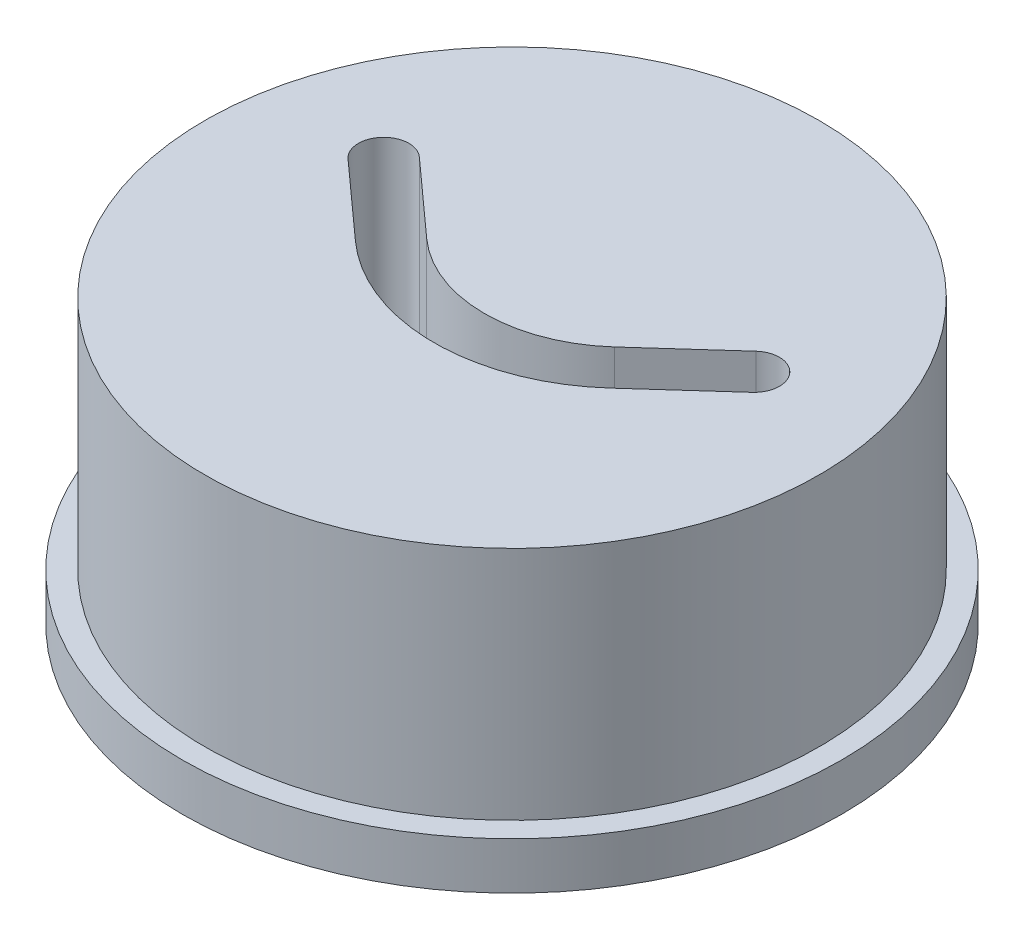
ISO-10303-21;
HEADER;
FILE_DESCRIPTION(('STEP AP214'),'2;1');
FILE_NAME('part.step','',(''),(''),'','','');
FILE_SCHEMA(('AUTOMOTIVE_DESIGN { 1 0 10303 214 1 1 1 1 }'));
ENDSEC;
DATA;
#1=APPLICATION_CONTEXT('core data for automotive mechanical design processes');
#2=APPLICATION_PROTOCOL_DEFINITION('international standard','automotive_design',2000,#1);
#3=PRODUCT_CONTEXT('',#1,'mechanical');
#4=PRODUCT('Part','Part','',(#3));
#5=PRODUCT_RELATED_PRODUCT_CATEGORY('part','',(#4));
#6=PRODUCT_DEFINITION_FORMATION('','',#4);
#7=PRODUCT_DEFINITION_CONTEXT('part definition',#1,'design');
#8=PRODUCT_DEFINITION('design','',#6,#7);
#9=PRODUCT_DEFINITION_SHAPE('','',#8);
#10=(LENGTH_UNIT() NAMED_UNIT(*) SI_UNIT(.MILLI.,.METRE.));
#11=(NAMED_UNIT(*) PLANE_ANGLE_UNIT() SI_UNIT($,.RADIAN.));
#12=(NAMED_UNIT(*) SI_UNIT($,.STERADIAN.) SOLID_ANGLE_UNIT());
#13=UNCERTAINTY_MEASURE_WITH_UNIT(LENGTH_MEASURE(1.E-05),#10,'distance_accuracy_value','');
#14=(GEOMETRIC_REPRESENTATION_CONTEXT(3) GLOBAL_UNCERTAINTY_ASSIGNED_CONTEXT((#13)) GLOBAL_UNIT_ASSIGNED_CONTEXT((#10,
#11,#12)) REPRESENTATION_CONTEXT('',''));
#15=CARTESIAN_POINT('',(0.,0.,0.));
#16=DIRECTION('',(0.,0.,1.));
#17=DIRECTION('',(1.,0.,0.));
#18=AXIS2_PLACEMENT_3D('',#15,#16,#17);
#19=CARTESIAN_POINT('',(0.,19.05,0.));
#20=DIRECTION('',(0.,-1.,0.));
#21=DIRECTION('',(0.,0.,-1.));
#22=AXIS2_PLACEMENT_3D('',#19,#20,#21);
#23=CYLINDRICAL_SURFACE('',#22,20.701);
#24=CARTESIAN_POINT('',(0.,19.05,0.));
#25=DIRECTION('',(0.,1.,0.));
#26=DIRECTION('',(0.,0.,1.));
#27=AXIS2_PLACEMENT_3D('',#24,#25,#26);
#28=CIRCLE('',#27,20.701);
#29=CARTESIAN_POINT('',(0.,19.05,-20.701));
#30=VERTEX_POINT('',#29);
#31=EDGE_CURVE('E282',#30,#30,#28,.T.);
#32=CARTESIAN_POINT('',(0.,3.175,0.));
#33=DIRECTION('',(0.,-1.,0.));
#34=DIRECTION('',(0.,0.,-1.));
#35=AXIS2_PLACEMENT_3D('',#32,#33,#34);
#36=CIRCLE('',#35,20.701);
#37=CARTESIAN_POINT('',(0.,3.175,-20.701));
#38=VERTEX_POINT('',#37);
#39=EDGE_CURVE('E11',#38,#38,#36,.T.);
#40=CARTESIAN_POINT('',(0.,19.05,-20.701));
#41=CARTESIAN_POINT('',(0.,18.8846354166667,-20.701));
#42=CARTESIAN_POINT('',(0.,18.7192708333333,-20.701));
#43=CARTESIAN_POINT('',(0.,18.3885416666667,-20.701));
#44=CARTESIAN_POINT('',(0.,18.2231770833333,-20.701));
#45=CARTESIAN_POINT('',(0.,17.8924479166667,-20.701));
#46=CARTESIAN_POINT('',(0.,17.7270833333333,-20.701));
#47=CARTESIAN_POINT('',(0.,17.3963541666667,-20.701));
#48=CARTESIAN_POINT('',(0.,17.2309895833333,-20.701));
#49=CARTESIAN_POINT('',(0.,16.9002604166667,-20.701));
#50=CARTESIAN_POINT('',(0.,16.7348958333333,-20.701));
#51=CARTESIAN_POINT('',(0.,16.4041666666667,-20.701));
#52=CARTESIAN_POINT('',(0.,16.2388020833333,-20.701));
#53=CARTESIAN_POINT('',(0.,15.9080729166667,-20.701));
#54=CARTESIAN_POINT('',(0.,15.7427083333333,-20.701));
#55=CARTESIAN_POINT('',(0.,15.4119791666667,-20.701));
#56=CARTESIAN_POINT('',(0.,15.2466145833333,-20.701));
#57=CARTESIAN_POINT('',(0.,14.9158854166667,-20.701));
#58=CARTESIAN_POINT('',(0.,14.7505208333333,-20.701));
#59=CARTESIAN_POINT('',(0.,14.4197916666667,-20.701));
#60=CARTESIAN_POINT('',(0.,14.2544270833333,-20.701));
#61=CARTESIAN_POINT('',(0.,13.9236979166667,-20.701));
#62=CARTESIAN_POINT('',(0.,13.7583333333333,-20.701));
#63=CARTESIAN_POINT('',(0.,13.4276041666667,-20.701));
#64=CARTESIAN_POINT('',(0.,13.2622395833333,-20.701));
#65=CARTESIAN_POINT('',(0.,12.9315104166667,-20.701));
#66=CARTESIAN_POINT('',(0.,12.7661458333333,-20.701));
#67=CARTESIAN_POINT('',(0.,12.4354166666667,-20.701));
#68=CARTESIAN_POINT('',(0.,12.2700520833333,-20.701));
#69=CARTESIAN_POINT('',(0.,11.9393229166667,-20.701));
#70=CARTESIAN_POINT('',(0.,11.7739583333333,-20.701));
#71=CARTESIAN_POINT('',(0.,11.4432291666667,-20.701));
#72=CARTESIAN_POINT('',(0.,11.2778645833333,-20.701));
#73=CARTESIAN_POINT('',(0.,10.9471354166667,-20.701));
#74=CARTESIAN_POINT('',(0.,10.7817708333333,-20.701));
#75=CARTESIAN_POINT('',(0.,10.4510416666667,-20.701));
#76=CARTESIAN_POINT('',(0.,10.2856770833333,-20.701));
#77=CARTESIAN_POINT('',(0.,9.95494791666667,-20.701));
#78=CARTESIAN_POINT('',(0.,9.78958333333334,-20.701));
#79=CARTESIAN_POINT('',(0.,9.45885416666667,-20.701));
#80=CARTESIAN_POINT('',(0.,9.29348958333334,-20.701));
#81=CARTESIAN_POINT('',(0.,8.96276041666667,-20.701));
#82=CARTESIAN_POINT('',(0.,8.79739583333334,-20.701));
#83=CARTESIAN_POINT('',(0.,8.46666666666667,-20.701));
#84=CARTESIAN_POINT('',(0.,8.30130208333334,-20.701));
#85=CARTESIAN_POINT('',(0.,7.97057291666667,-20.701));
#86=CARTESIAN_POINT('',(0.,7.80520833333334,-20.701));
#87=CARTESIAN_POINT('',(0.,7.47447916666667,-20.701));
#88=CARTESIAN_POINT('',(0.,7.30911458333334,-20.701));
#89=CARTESIAN_POINT('',(0.,6.97838541666667,-20.701));
#90=CARTESIAN_POINT('',(0.,6.81302083333334,-20.701));
#91=CARTESIAN_POINT('',(0.,6.48229166666667,-20.701));
#92=CARTESIAN_POINT('',(0.,6.31692708333334,-20.701));
#93=CARTESIAN_POINT('',(0.,5.98619791666667,-20.701));
#94=CARTESIAN_POINT('',(0.,5.82083333333334,-20.701));
#95=CARTESIAN_POINT('',(0.,5.49010416666667,-20.701));
#96=CARTESIAN_POINT('',(0.,5.32473958333334,-20.701));
#97=CARTESIAN_POINT('',(0.,4.99401041666667,-20.701));
#98=CARTESIAN_POINT('',(0.,4.82864583333334,-20.701));
#99=CARTESIAN_POINT('',(0.,4.49791666666667,-20.701));
#100=CARTESIAN_POINT('',(0.,4.33255208333334,-20.701));
#101=CARTESIAN_POINT('',(0.,4.00182291666667,-20.701));
#102=CARTESIAN_POINT('',(0.,3.83645833333334,-20.701));
#103=CARTESIAN_POINT('',(0.,3.50572916666667,-20.701));
#104=CARTESIAN_POINT('',(0.,3.34036458333334,-20.701));
#105=CARTESIAN_POINT('',(0.,3.175,-20.701));
#106=B_SPLINE_CURVE_WITH_KNOTS('',3,(#40,#41,#42,#43,#44,#45,#46,#47,#48,#49,#50,#51,#52,#53,
#54,#55,#56,#57,#58,#59,#60,#61,#62,#63,#64,#65,#66,#67,#68,#69,#70,#71,#72,#73,#74,#75,#76,#77,
#78,#79,#80,#81,#82,#83,#84,#85,#86,#87,#88,#89,#90,#91,#92,#93,#94,#95,#96,#97,#98,#99,#100,
#101,#102,#103,#104,#105),.UNSPECIFIED.,.F.,.F.,(4,2,2,2,2,2,2,2,2,2,2,2,2,2,2,2,2,2,2,2,2,2,2,
2,2,2,2,2,2,2,2,2,4),(0.,0.496093749999999,0.992187499999998,1.48828125,1.984375,2.48046875,
2.9765625,3.47265625,3.96875,4.46484375,4.9609375,5.45703125,5.953125,6.44921875,
6.94531249999999,7.44140625,7.93749999999999,8.43359374999999,8.92968749999999,9.42578124999999,
9.92187499999999,10.41796875,10.9140625,11.41015625,11.90625,12.40234375,12.8984375,13.39453125,
13.890625,14.38671875,14.8828125,15.37890625,15.875),.UNSPECIFIED.);
#107=EDGE_CURVE('BSEAM37',#30,#38,#106,.T.);
#108=ORIENTED_EDGE('',*,*,#31,.F.);
#109=ORIENTED_EDGE('',*,*,#39,.F.);
#110=ORIENTED_EDGE('',*,*,#107,.T.);
#111=ORIENTED_EDGE('',*,*,#107,.F.);
#112=EDGE_LOOP('',(#108,#110,#109,#111));
#113=FACE_BOUND('',#112,.T.);
#114=ADVANCED_FACE('F37',(#113),#23,.T.);
#115=CARTESIAN_POINT('',(-12.4859182363819,19.05,-3.83545340078554));
#116=DIRECTION('',(0.,-1.,0.));
#117=DIRECTION('',(0.,0.,-1.));
#118=AXIS2_PLACEMENT_3D('',#115,#116,#117);
#119=CYLINDRICAL_SURFACE('',#118,0.889000000000001);
#120=CARTESIAN_POINT('',(-12.4859182363819,0.,-3.83545340078554));
#121=DIRECTION('',(0.,1.,0.));
#122=DIRECTION('',(0.,0.,-1.));
#123=AXIS2_PLACEMENT_3D('',#120,#121,#122);
#124=CIRCLE('',#123,0.889000000000001);
#125=CARTESIAN_POINT('',(-11.8908364727639,0.,-4.49590680157107));
#126=VERTEX_POINT('',#125);
#127=CARTESIAN_POINT('',(-13.081,0.,-3.175));
#128=VERTEX_POINT('',#127);
#129=EDGE_CURVE('E242',#126,#128,#124,.T.);
#130=ORIENTED_EDGE('',*,*,#129,.F.);
#131=DIRECTION('',(0.,-1.,0.));
#132=VECTOR('',#131,1.);
#133=CARTESIAN_POINT('',(-11.8908364727638,19.05,-4.49590680157107));
#134=LINE('',#133,#132);
#135=CARTESIAN_POINT('',(-11.8908364727638,6.35,-4.49590680157107));
#136=VERTEX_POINT('',#135);
#137=EDGE_CURVE('E266',#136,#126,#134,.T.);
#138=ORIENTED_EDGE('',*,*,#137,.F.);
#139=CARTESIAN_POINT('',(-12.4859182363819,6.35,-3.83545340078554));
#140=DIRECTION('',(0.,1.,0.));
#141=DIRECTION('',(0.,0.,1.));
#142=AXIS2_PLACEMENT_3D('',#139,#140,#141);
#143=CIRCLE('',#142,0.889000000000001);
#144=CARTESIAN_POINT('',(-13.081,6.35,-3.175));
#145=VERTEX_POINT('',#144);
#146=EDGE_CURVE('E59',#136,#145,#143,.T.);
#147=ORIENTED_EDGE('',*,*,#146,.T.);
#148=DIRECTION('',(0.,-1.,0.));
#149=VECTOR('',#148,1.);
#150=CARTESIAN_POINT('',(-13.081,19.05,-3.175));
#151=LINE('',#150,#149);
#152=EDGE_CURVE('E280',#145,#128,#151,.T.);
#153=ORIENTED_EDGE('',*,*,#152,.T.);
#154=EDGE_LOOP('',(#130,#138,#147,#153));
#155=FACE_BOUND('',#154,.T.);
#156=ADVANCED_FACE('F291',(#155),#119,.F.);
#157=CARTESIAN_POINT('',(-13.081,19.05,-3.175));
#158=DIRECTION('',(0.66938331115646,0.,-0.742917211232324));
#159=DIRECTION('',(-0.742917211232324,0.,-0.66938331115646));
#160=AXIS2_PLACEMENT_3D('',#157,#158,#159);
#161=PLANE('',#160);
#162=DIRECTION('',(0.742917211232324,0.,0.66938331115646));
#163=VECTOR('',#162,1.);
#164=CARTESIAN_POINT('',(-13.081,0.,-3.175));
#165=LINE('',#164,#163);
#166=CARTESIAN_POINT('',(-8.05910731299933,0.,1.34982605635276));
#167=VERTEX_POINT('',#166);
#168=EDGE_CURVE('E245',#128,#167,#165,.T.);
#169=ORIENTED_EDGE('',*,*,#168,.F.);
#170=ORIENTED_EDGE('',*,*,#152,.F.);
#171=DIRECTION('',(0.742917211232324,0.,0.66938331115646));
#172=VECTOR('',#171,1.);
#173=CARTESIAN_POINT('',(-13.081,6.35,-3.175));
#174=LINE('',#173,#172);
#175=CARTESIAN_POINT('',(-8.05910731299933,6.35,1.34982605635276));
#176=VERTEX_POINT('',#175);
#177=EDGE_CURVE('E238',#145,#176,#174,.T.);
#178=ORIENTED_EDGE('',*,*,#177,.T.);
#179=DIRECTION('',(0.,-1.,0.));
#180=VECTOR('',#179,1.);
#181=CARTESIAN_POINT('',(-8.05910731299933,19.05,1.34982605635276));
#182=LINE('',#181,#180);
#183=EDGE_CURVE('E278',#176,#167,#182,.T.);
#184=ORIENTED_EDGE('',*,*,#183,.T.);
#185=EDGE_LOOP('',(#169,#170,#178,#184));
#186=FACE_BOUND('',#185,.T.);
#187=ADVANCED_FACE('F318',(#186),#161,.T.);
#188=CARTESIAN_POINT('',(0.,19.05,-7.59459999999993));
#189=DIRECTION('',(0.,-1.,0.));
#190=DIRECTION('',(0.,0.,-1.));
#191=AXIS2_PLACEMENT_3D('',#188,#189,#190);
#192=CYLINDRICAL_SURFACE('',#191,12.0396);
#193=CARTESIAN_POINT('',(0.,0.,-7.59459999999993));
#194=DIRECTION('',(0.,1.,0.));
#195=DIRECTION('',(0.,0.,1.));
#196=AXIS2_PLACEMENT_3D('',#193,#194,#195);
#197=CIRCLE('',#196,12.0396);
#198=CARTESIAN_POINT('',(8.05910731299933,0.,1.34982605635276));
#199=VERTEX_POINT('',#198);
#200=EDGE_CURVE('E248',#167,#199,#197,.T.);
#201=ORIENTED_EDGE('',*,*,#200,.F.);
#202=ORIENTED_EDGE('',*,*,#183,.F.);
#203=CARTESIAN_POINT('',(0.,6.35,-7.59459999999993));
#204=DIRECTION('',(0.,1.,0.));
#205=DIRECTION('',(0.,0.,1.));
#206=AXIS2_PLACEMENT_3D('',#203,#204,#205);
#207=CIRCLE('',#206,12.0396);
#208=CARTESIAN_POINT('',(8.05910731299933,6.35,1.34982605635276));
#209=VERTEX_POINT('',#208);
#210=EDGE_CURVE('E235',#176,#209,#207,.T.);
#211=ORIENTED_EDGE('',*,*,#210,.T.);
#212=DIRECTION('',(0.,-1.,0.));
#213=VECTOR('',#212,1.);
#214=CARTESIAN_POINT('',(8.05910731299933,19.05,1.34982605635276));
#215=LINE('',#214,#213);
#216=EDGE_CURVE('E276',#209,#199,#215,.T.);
#217=ORIENTED_EDGE('',*,*,#216,.T.);
#218=EDGE_LOOP('',(#201,#202,#211,#217));
#219=FACE_BOUND('',#218,.T.);
#220=ADVANCED_FACE('F315',(#219),#192,.F.);
#221=CARTESIAN_POINT('',(13.081,19.05,-3.175));
#222=DIRECTION('',(-0.66938331115646,0.,-0.742917211232324));
#223=DIRECTION('',(-0.742917211232324,0.,0.66938331115646));
#224=AXIS2_PLACEMENT_3D('',#221,#222,#223);
#225=PLANE('',#224);
#226=DIRECTION('',(0.742917211232324,0.,-0.66938331115646));
#227=VECTOR('',#226,1.);
#228=CARTESIAN_POINT('',(13.081,0.,-3.175));
#229=LINE('',#228,#227);
#230=CARTESIAN_POINT('',(13.081,0.,-3.175));
#231=VERTEX_POINT('',#230);
#232=EDGE_CURVE('E251',#199,#231,#229,.T.);
#233=ORIENTED_EDGE('',*,*,#232,.F.);
#234=ORIENTED_EDGE('',*,*,#216,.F.);
#235=DIRECTION('',(0.742917211232324,0.,-0.66938331115646));
#236=VECTOR('',#235,1.);
#237=CARTESIAN_POINT('',(13.081,6.35,-3.175));
#238=LINE('',#237,#236);
#239=CARTESIAN_POINT('',(13.081,6.35,-3.175));
#240=VERTEX_POINT('',#239);
#241=EDGE_CURVE('E232',#209,#240,#238,.T.);
#242=ORIENTED_EDGE('',*,*,#241,.T.);
#243=DIRECTION('',(0.,-1.,0.));
#244=VECTOR('',#243,1.);
#245=CARTESIAN_POINT('',(13.081,19.05,-3.175));
#246=LINE('',#245,#244);
#247=EDGE_CURVE('E274',#240,#231,#246,.T.);
#248=ORIENTED_EDGE('',*,*,#247,.T.);
#249=EDGE_LOOP('',(#233,#234,#242,#248));
#250=FACE_BOUND('',#249,.T.);
#251=ADVANCED_FACE('F312',(#250),#225,.T.);
#252=CARTESIAN_POINT('',(12.4859182363819,19.05,-3.83545340078554));
#253=DIRECTION('',(0.,-1.,0.));
#254=DIRECTION('',(0.,0.,-1.));
#255=AXIS2_PLACEMENT_3D('',#252,#253,#254);
#256=CYLINDRICAL_SURFACE('',#255,0.889000000000001);
#257=CARTESIAN_POINT('',(12.4859182363819,0.,-3.83545340078554));
#258=DIRECTION('',(0.,1.,0.));
#259=DIRECTION('',(0.,0.,-1.));
#260=AXIS2_PLACEMENT_3D('',#257,#258,#259);
#261=CIRCLE('',#260,0.889000000000001);
#262=CARTESIAN_POINT('',(11.8908364727638,0.,-4.49590680157107));
#263=VERTEX_POINT('',#262);
#264=EDGE_CURVE('E254',#231,#263,#261,.T.);
#265=ORIENTED_EDGE('',*,*,#264,.F.);
#266=ORIENTED_EDGE('',*,*,#247,.F.);
#267=CARTESIAN_POINT('',(12.4859182363819,6.35,-3.83545340078554));
#268=DIRECTION('',(0.,1.,0.));
#269=DIRECTION('',(0.,0.,1.));
#270=AXIS2_PLACEMENT_3D('',#267,#268,#269);
#271=CIRCLE('',#270,0.889000000000001);
#272=CARTESIAN_POINT('',(11.8908364727638,6.35,-4.49590680157107));
#273=VERTEX_POINT('',#272);
#274=EDGE_CURVE('E229',#240,#273,#271,.T.);
#275=ORIENTED_EDGE('',*,*,#274,.T.);
#276=DIRECTION('',(0.,-1.,0.));
#277=VECTOR('',#276,1.);
#278=CARTESIAN_POINT('',(11.8908364727638,19.05,-4.49590680157107));
#279=LINE('',#278,#277);
#280=EDGE_CURVE('E272',#273,#263,#279,.T.);
#281=ORIENTED_EDGE('',*,*,#280,.T.);
#282=EDGE_LOOP('',(#265,#266,#275,#281));
#283=FACE_BOUND('',#282,.T.);
#284=ADVANCED_FACE('F307',(#283),#256,.F.);
#285=CARTESIAN_POINT('',(11.8908364727638,19.05,-4.49590680157107));
#286=DIRECTION('',(0.66938331115646,0.,0.742917211232324));
#287=DIRECTION('',(0.742917211232324,0.,-0.66938331115646));
#288=AXIS2_PLACEMENT_3D('',#285,#286,#287);
#289=PLANE('',#288);
#290=DIRECTION('',(-0.742917211232324,0.,0.66938331115646));
#291=VECTOR('',#290,1.);
#292=CARTESIAN_POINT('',(11.8908364727638,0.,-4.49590680157107));
#293=LINE('',#292,#291);
#294=CARTESIAN_POINT('',(6.86894378576314,0.,0.0289192547816858));
#295=VERTEX_POINT('',#294);
#296=EDGE_CURVE('E257',#263,#295,#293,.T.);
#297=ORIENTED_EDGE('',*,*,#296,.F.);
#298=ORIENTED_EDGE('',*,*,#280,.F.);
#299=DIRECTION('',(-0.742917211232324,0.,0.66938331115646));
#300=VECTOR('',#299,1.);
#301=CARTESIAN_POINT('',(11.8908364727638,6.35,-4.49590680157107));
#302=LINE('',#301,#300);
#303=CARTESIAN_POINT('',(6.86894378576314,6.35,0.0289192547816858));
#304=VERTEX_POINT('',#303);
#305=EDGE_CURVE('E226',#273,#304,#302,.T.);
#306=ORIENTED_EDGE('',*,*,#305,.T.);
#307=DIRECTION('',(0.,-1.,0.));
#308=VECTOR('',#307,1.);
#309=CARTESIAN_POINT('',(6.86894378576314,19.05,0.0289192547816858));
#310=LINE('',#309,#308);
#311=EDGE_CURVE('E270',#304,#295,#310,.T.);
#312=ORIENTED_EDGE('',*,*,#311,.T.);
#313=EDGE_LOOP('',(#297,#298,#306,#312));
#314=FACE_BOUND('',#313,.T.);
#315=ADVANCED_FACE('F304',(#314),#289,.T.);
#316=CARTESIAN_POINT('',(0.,19.05,-7.59459999999993));
#317=DIRECTION('',(0.,-1.,0.));
#318=DIRECTION('',(0.,0.,-1.));
#319=AXIS2_PLACEMENT_3D('',#316,#317,#318);
#320=CYLINDRICAL_SURFACE('',#319,10.2616);
#321=CARTESIAN_POINT('',(0.,0.,-7.59459999999993));
#322=DIRECTION('',(0.,-1.,0.));
#323=DIRECTION('',(0.,0.,1.));
#324=AXIS2_PLACEMENT_3D('',#321,#322,#323);
#325=CIRCLE('',#324,10.2616);
#326=CARTESIAN_POINT('',(-6.86894378576314,0.,0.0289192547816876));
#327=VERTEX_POINT('',#326);
#328=EDGE_CURVE('E260',#295,#327,#325,.T.);
#329=ORIENTED_EDGE('',*,*,#328,.F.);
#330=ORIENTED_EDGE('',*,*,#311,.F.);
#331=CARTESIAN_POINT('',(0.,6.35,-7.59459999999993));
#332=DIRECTION('',(0.,1.,0.));
#333=DIRECTION('',(0.,0.,1.));
#334=AXIS2_PLACEMENT_3D('',#331,#332,#333);
#335=CIRCLE('',#334,10.2616);
#336=CARTESIAN_POINT('',(-6.86894378576314,6.35,0.0289192547816867));
#337=VERTEX_POINT('',#336);
#338=EDGE_CURVE('E212',#304,#337,#335,.F.);
#339=ORIENTED_EDGE('',*,*,#338,.T.);
#340=DIRECTION('',(0.,-1.,0.));
#341=VECTOR('',#340,1.);
#342=CARTESIAN_POINT('',(-6.86894378576314,19.05,0.0289192547816876));
#343=LINE('',#342,#341);
#344=EDGE_CURVE('E268',#337,#327,#343,.T.);
#345=ORIENTED_EDGE('',*,*,#344,.T.);
#346=EDGE_LOOP('',(#329,#330,#339,#345));
#347=FACE_BOUND('',#346,.T.);
#348=ADVANCED_FACE('F301',(#347),#320,.T.);
#349=CARTESIAN_POINT('',(-11.8908364727638,19.05,-4.49590680157107));
#350=DIRECTION('',(-0.669383311156461,0.,0.742917211232324));
#351=DIRECTION('',(0.742917211232324,0.,0.669383311156461));
#352=AXIS2_PLACEMENT_3D('',#349,#350,#351);
#353=PLANE('',#352);
#354=DIRECTION('',(-0.742917211232324,0.,-0.669383311156461));
#355=VECTOR('',#354,1.);
#356=CARTESIAN_POINT('',(-11.8908364727638,0.,-4.49590680157107));
#357=LINE('',#356,#355);
#358=EDGE_CURVE('E263',#327,#126,#357,.T.);
#359=ORIENTED_EDGE('',*,*,#358,.F.);
#360=ORIENTED_EDGE('',*,*,#344,.F.);
#361=DIRECTION('',(-0.742917211232324,0.,-0.669383311156461));
#362=VECTOR('',#361,1.);
#363=CARTESIAN_POINT('',(-11.8908364727638,6.35,-4.49590680157107));
#364=LINE('',#363,#362);
#365=EDGE_CURVE('E44',#337,#136,#364,.T.);
#366=ORIENTED_EDGE('',*,*,#365,.T.);
#367=ORIENTED_EDGE('',*,*,#137,.T.);
#368=EDGE_LOOP('',(#359,#360,#366,#367));
#369=FACE_BOUND('',#368,.T.);
#370=ADVANCED_FACE('F288',(#369),#353,.T.);
#371=CARTESIAN_POINT('',(0.,19.05,0.));
#372=DIRECTION('',(0.,1.,0.));
#373=DIRECTION('',(0.,0.,1.));
#374=AXIS2_PLACEMENT_3D('',#371,#372,#373);
#375=PLANE('',#374);
#376=CARTESIAN_POINT('',(12.4859182363819,19.05,-3.83545340078554));
#377=DIRECTION('',(0.,1.,0.));
#378=DIRECTION('',(0.,0.,1.));
#379=AXIS2_PLACEMENT_3D('',#376,#377,#378);
#380=CIRCLE('',#379,1.7018);
#381=CARTESIAN_POINT('',(13.625074755308,19.05,-2.57115689071037));
#382=VERTEX_POINT('',#381);
#383=CARTESIAN_POINT('',(11.3467617174559,19.05,-5.09974991086071));
#384=VERTEX_POINT('',#383);
#385=EDGE_CURVE('E51',#382,#384,#380,.T.);
#386=ORIENTED_EDGE('',*,*,#385,.F.);
#387=DIRECTION('',(0.742917211232324,0.,-0.66938331115646));
#388=VECTOR('',#387,1.);
#389=CARTESIAN_POINT('',(8.6031820683073,19.05,1.95366916564239));
#390=LINE('',#389,#388);
#391=CARTESIAN_POINT('',(8.6031820683073,19.05,1.95366916564239));
#392=VERTEX_POINT('',#391);
#393=EDGE_CURVE('E170',#392,#382,#390,.T.);
#394=ORIENTED_EDGE('',*,*,#393,.F.);
#395=CARTESIAN_POINT('',(0.,19.05,-7.59459999999993));
#396=DIRECTION('',(0.,1.,0.));
#397=DIRECTION('',(0.,0.,1.));
#398=AXIS2_PLACEMENT_3D('',#395,#396,#397);
#399=CIRCLE('',#398,12.8524);
#400=CARTESIAN_POINT('',(-8.6031820683073,19.05,1.95366916564239));
#401=VERTEX_POINT('',#400);
#402=EDGE_CURVE('E173',#401,#392,#399,.T.);
#403=ORIENTED_EDGE('',*,*,#402,.F.);
#404=DIRECTION('',(0.742917211232324,0.,0.66938331115646));
#405=VECTOR('',#404,1.);
#406=CARTESIAN_POINT('',(-13.625074755308,19.05,-2.57115689071037));
#407=LINE('',#406,#405);
#408=CARTESIAN_POINT('',(-13.625074755308,19.05,-2.57115689071037));
#409=VERTEX_POINT('',#408);
#410=EDGE_CURVE('E205',#409,#401,#407,.T.);
#411=ORIENTED_EDGE('',*,*,#410,.F.);
#412=CARTESIAN_POINT('',(-12.4859182363819,19.05,-3.83545340078554));
#413=DIRECTION('',(0.,1.,0.));
#414=DIRECTION('',(0.,0.,1.));
#415=AXIS2_PLACEMENT_3D('',#412,#413,#414);
#416=CIRCLE('',#415,1.7018);
#417=CARTESIAN_POINT('',(-11.3467617174559,19.05,-5.09974991086071));
#418=VERTEX_POINT('',#417);
#419=EDGE_CURVE('E202',#418,#409,#416,.T.);
#420=ORIENTED_EDGE('',*,*,#419,.F.);
#421=DIRECTION('',(-0.742917211232324,0.,-0.669383311156461));
#422=VECTOR('',#421,1.);
#423=CARTESIAN_POINT('',(-6.32486903045517,19.05,-0.574923854507948));
#424=LINE('',#423,#422);
#425=CARTESIAN_POINT('',(-6.32486903045517,19.05,-0.574923854507948));
#426=VERTEX_POINT('',#425);
#427=EDGE_CURVE('E199',#426,#418,#424,.T.);
#428=ORIENTED_EDGE('',*,*,#427,.F.);
#429=CARTESIAN_POINT('',(0.,19.05,-7.59459999999993));
#430=DIRECTION('',(0.,-1.,0.));
#431=DIRECTION('',(0.,0.,1.));
#432=AXIS2_PLACEMENT_3D('',#429,#430,#431);
#433=CIRCLE('',#432,9.44880000000001);
#434=CARTESIAN_POINT('',(6.32486903045518,19.05,-0.574923854507948));
#435=VERTEX_POINT('',#434);
#436=EDGE_CURVE('E196',#435,#426,#433,.T.);
#437=ORIENTED_EDGE('',*,*,#436,.F.);
#438=DIRECTION('',(-0.742917211232324,0.,0.669383311156461));
#439=VECTOR('',#438,1.);
#440=CARTESIAN_POINT('',(11.3467617174559,19.05,-5.09974991086071));
#441=LINE('',#440,#439);
#442=EDGE_CURVE('E193',#384,#435,#441,.T.);
#443=ORIENTED_EDGE('',*,*,#442,.F.);
#444=EDGE_LOOP('',(#386,#394,#403,#411,#420,#428,#437,#443));
#445=FACE_BOUND('',#444,.T.);
#446=ORIENTED_EDGE('',*,*,#31,.T.);
#447=EDGE_LOOP('',(#446));
#448=FACE_BOUND('',#447,.T.);
#449=ADVANCED_FACE('F383',(#445,#448),#375,.T.);
#450=CARTESIAN_POINT('',(0.,0.,0.));
#451=DIRECTION('',(0.,1.,0.));
#452=DIRECTION('',(0.,0.,1.));
#453=AXIS2_PLACEMENT_3D('',#450,#451,#452);
#454=PLANE('',#453);
#455=ORIENTED_EDGE('',*,*,#129,.T.);
#456=ORIENTED_EDGE('',*,*,#168,.T.);
#457=ORIENTED_EDGE('',*,*,#200,.T.);
#458=ORIENTED_EDGE('',*,*,#232,.T.);
#459=ORIENTED_EDGE('',*,*,#264,.T.);
#460=ORIENTED_EDGE('',*,*,#296,.T.);
#461=ORIENTED_EDGE('',*,*,#328,.T.);
#462=ORIENTED_EDGE('',*,*,#358,.T.);
#463=EDGE_LOOP('',(#455,#456,#457,#458,#459,#460,#461,#462));
#464=FACE_BOUND('',#463,.T.);
#465=CARTESIAN_POINT('',(0.,0.,0.));
#466=DIRECTION('',(0.,-1.,0.));
#467=DIRECTION('',(0.,0.,-1.));
#468=AXIS2_PLACEMENT_3D('',#465,#466,#467);
#469=CIRCLE('',#468,22.225);
#470=CARTESIAN_POINT('',(0.,0.,-22.225));
#471=VERTEX_POINT('',#470);
#472=EDGE_CURVE('E176',#471,#471,#469,.T.);
#473=ORIENTED_EDGE('',*,*,#472,.T.);
#474=EDGE_LOOP('',(#473));
#475=FACE_BOUND('',#474,.T.);
#476=ADVANCED_FACE('F295',(#464,#475),#454,.F.);
#477=CARTESIAN_POINT('',(12.4859182363819,6.35,-3.83545340078554));
#478=DIRECTION('',(0.,1.,0.));
#479=DIRECTION('',(0.,0.,1.));
#480=AXIS2_PLACEMENT_3D('',#477,#478,#479);
#481=CYLINDRICAL_SURFACE('',#480,1.7018);
#482=ORIENTED_EDGE('',*,*,#385,.T.);
#483=DIRECTION('',(0.,1.,0.));
#484=VECTOR('',#483,1.);
#485=CARTESIAN_POINT('',(11.3467617174559,6.35,-5.09974991086071));
#486=LINE('',#485,#484);
#487=CARTESIAN_POINT('',(11.3467617174559,6.35,-5.09974991086071));
#488=VERTEX_POINT('',#487);
#489=EDGE_CURVE('E147',#488,#384,#486,.T.);
#490=ORIENTED_EDGE('',*,*,#489,.F.);
#491=CARTESIAN_POINT('',(12.4859182363819,6.35,-3.83545340078554));
#492=DIRECTION('',(0.,1.,0.));
#493=DIRECTION('',(0.,0.,1.));
#494=AXIS2_PLACEMENT_3D('',#491,#492,#493);
#495=CIRCLE('',#494,1.7018);
#496=CARTESIAN_POINT('',(13.625074755308,6.35,-2.57115689071037));
#497=VERTEX_POINT('',#496);
#498=EDGE_CURVE('E151',#497,#488,#495,.T.);
#499=ORIENTED_EDGE('',*,*,#498,.F.);
#500=DIRECTION('',(0.,1.,0.));
#501=VECTOR('',#500,1.);
#502=CARTESIAN_POINT('',(13.625074755308,6.35,-2.57115689071037));
#503=LINE('',#502,#501);
#504=EDGE_CURVE('E210',#497,#382,#503,.T.);
#505=ORIENTED_EDGE('',*,*,#504,.T.);
#506=EDGE_LOOP('',(#482,#490,#499,#505));
#507=FACE_BOUND('',#506,.T.);
#508=ADVANCED_FACE('F149',(#507),#481,.F.);
#509=CARTESIAN_POINT('',(8.6031820683073,6.35,1.95366916564239));
#510=DIRECTION('',(0.66938331115646,0.,0.742917211232324));
#511=DIRECTION('',(0.742917211232324,0.,-0.66938331115646));
#512=AXIS2_PLACEMENT_3D('',#509,#510,#511);
#513=PLANE('',#512);
#514=ORIENTED_EDGE('',*,*,#393,.T.);
#515=ORIENTED_EDGE('',*,*,#504,.F.);
#516=DIRECTION('',(0.742917211232324,0.,-0.66938331115646));
#517=VECTOR('',#516,1.);
#518=CARTESIAN_POINT('',(8.6031820683073,6.35,1.95366916564239));
#519=LINE('',#518,#517);
#520=CARTESIAN_POINT('',(8.6031820683073,6.35,1.95366916564239));
#521=VERTEX_POINT('',#520);
#522=EDGE_CURVE('E157',#521,#497,#519,.T.);
#523=ORIENTED_EDGE('',*,*,#522,.F.);
#524=DIRECTION('',(0.,1.,0.));
#525=VECTOR('',#524,1.);
#526=CARTESIAN_POINT('',(8.6031820683073,6.35,1.95366916564239));
#527=LINE('',#526,#525);
#528=EDGE_CURVE('E213',#521,#392,#527,.T.);
#529=ORIENTED_EDGE('',*,*,#528,.T.);
#530=EDGE_LOOP('',(#514,#515,#523,#529));
#531=FACE_BOUND('',#530,.T.);
#532=ADVANCED_FACE('F353',(#531),#513,.F.);
#533=CARTESIAN_POINT('',(0.,6.35,-7.59459999999993));
#534=DIRECTION('',(0.,1.,0.));
#535=DIRECTION('',(0.,0.,1.));
#536=AXIS2_PLACEMENT_3D('',#533,#534,#535);
#537=CYLINDRICAL_SURFACE('',#536,12.8524);
#538=ORIENTED_EDGE('',*,*,#402,.T.);
#539=ORIENTED_EDGE('',*,*,#528,.F.);
#540=CARTESIAN_POINT('',(0.,6.35,-7.59459999999993));
#541=DIRECTION('',(0.,1.,0.));
#542=DIRECTION('',(0.,0.,1.));
#543=AXIS2_PLACEMENT_3D('',#540,#541,#542);
#544=CIRCLE('',#543,12.8524);
#545=CARTESIAN_POINT('',(-8.6031820683073,6.35,1.95366916564239));
#546=VERTEX_POINT('',#545);
#547=EDGE_CURVE('E189',#546,#521,#544,.T.);
#548=ORIENTED_EDGE('',*,*,#547,.F.);
#549=DIRECTION('',(0.,1.,0.));
#550=VECTOR('',#549,1.);
#551=CARTESIAN_POINT('',(-8.6031820683073,6.35,1.95366916564239));
#552=LINE('',#551,#550);
#553=EDGE_CURVE('E215',#546,#401,#552,.T.);
#554=ORIENTED_EDGE('',*,*,#553,.T.);
#555=EDGE_LOOP('',(#538,#539,#548,#554));
#556=FACE_BOUND('',#555,.T.);
#557=ADVANCED_FACE('F356',(#556),#537,.F.);
#558=CARTESIAN_POINT('',(-13.625074755308,6.35,-2.57115689071037));
#559=DIRECTION('',(-0.66938331115646,0.,0.742917211232324));
#560=DIRECTION('',(0.742917211232324,0.,0.66938331115646));
#561=AXIS2_PLACEMENT_3D('',#558,#559,#560);
#562=PLANE('',#561);
#563=ORIENTED_EDGE('',*,*,#410,.T.);
#564=ORIENTED_EDGE('',*,*,#553,.F.);
#565=DIRECTION('',(0.742917211232324,0.,0.66938331115646));
#566=VECTOR('',#565,1.);
#567=CARTESIAN_POINT('',(-13.625074755308,6.35,-2.57115689071037));
#568=LINE('',#567,#566);
#569=CARTESIAN_POINT('',(-13.625074755308,6.35,-2.57115689071037));
#570=VERTEX_POINT('',#569);
#571=EDGE_CURVE('E186',#570,#546,#568,.T.);
#572=ORIENTED_EDGE('',*,*,#571,.F.);
#573=DIRECTION('',(0.,1.,0.));
#574=VECTOR('',#573,1.);
#575=CARTESIAN_POINT('',(-13.625074755308,6.35,-2.57115689071037));
#576=LINE('',#575,#574);
#577=EDGE_CURVE('E217',#570,#409,#576,.T.);
#578=ORIENTED_EDGE('',*,*,#577,.T.);
#579=EDGE_LOOP('',(#563,#564,#572,#578));
#580=FACE_BOUND('',#579,.T.);
#581=ADVANCED_FACE('F360',(#580),#562,.F.);
#582=CARTESIAN_POINT('',(-12.4859182363819,6.35,-3.83545340078554));
#583=DIRECTION('',(0.,1.,0.));
#584=DIRECTION('',(0.,0.,1.));
#585=AXIS2_PLACEMENT_3D('',#582,#583,#584);
#586=CYLINDRICAL_SURFACE('',#585,1.7018);
#587=ORIENTED_EDGE('',*,*,#419,.T.);
#588=ORIENTED_EDGE('',*,*,#577,.F.);
#589=CARTESIAN_POINT('',(-12.4859182363819,6.35,-3.83545340078554));
#590=DIRECTION('',(0.,1.,0.));
#591=DIRECTION('',(0.,0.,1.));
#592=AXIS2_PLACEMENT_3D('',#589,#590,#591);
#593=CIRCLE('',#592,1.7018);
#594=CARTESIAN_POINT('',(-11.3467617174559,6.35,-5.09974991086071));
#595=VERTEX_POINT('',#594);
#596=EDGE_CURVE('E183',#595,#570,#593,.T.);
#597=ORIENTED_EDGE('',*,*,#596,.F.);
#598=DIRECTION('',(0.,1.,0.));
#599=VECTOR('',#598,1.);
#600=CARTESIAN_POINT('',(-11.3467617174559,6.35,-5.09974991086071));
#601=LINE('',#600,#599);
#602=EDGE_CURVE('E219',#595,#418,#601,.T.);
#603=ORIENTED_EDGE('',*,*,#602,.T.);
#604=EDGE_LOOP('',(#587,#588,#597,#603));
#605=FACE_BOUND('',#604,.T.);
#606=ADVANCED_FACE('F364',(#605),#586,.F.);
#607=CARTESIAN_POINT('',(-6.32486903045517,6.35,-0.574923854507948));
#608=DIRECTION('',(0.669383311156461,0.,-0.742917211232324));
#609=DIRECTION('',(-0.742917211232324,0.,-0.669383311156461));
#610=AXIS2_PLACEMENT_3D('',#607,#608,#609);
#611=PLANE('',#610);
#612=ORIENTED_EDGE('',*,*,#427,.T.);
#613=ORIENTED_EDGE('',*,*,#602,.F.);
#614=DIRECTION('',(-0.742917211232324,0.,-0.669383311156461));
#615=VECTOR('',#614,1.);
#616=CARTESIAN_POINT('',(-6.32486903045517,6.35,-0.574923854507948));
#617=LINE('',#616,#615);
#618=CARTESIAN_POINT('',(-6.32486903045517,6.35,-0.574923854507948));
#619=VERTEX_POINT('',#618);
#620=EDGE_CURVE('E180',#619,#595,#617,.T.);
#621=ORIENTED_EDGE('',*,*,#620,.F.);
#622=DIRECTION('',(0.,1.,0.));
#623=VECTOR('',#622,1.);
#624=CARTESIAN_POINT('',(-6.32486903045517,6.35,-0.574923854507948));
#625=LINE('',#624,#623);
#626=EDGE_CURVE('E221',#619,#426,#625,.T.);
#627=ORIENTED_EDGE('',*,*,#626,.T.);
#628=EDGE_LOOP('',(#612,#613,#621,#627));
#629=FACE_BOUND('',#628,.T.);
#630=ADVANCED_FACE('F368',(#629),#611,.F.);
#631=CARTESIAN_POINT('',(0.,6.35,-7.59459999999993));
#632=DIRECTION('',(0.,1.,0.));
#633=DIRECTION('',(0.,0.,1.));
#634=AXIS2_PLACEMENT_3D('',#631,#632,#633);
#635=CYLINDRICAL_SURFACE('',#634,9.44880000000001);
#636=ORIENTED_EDGE('',*,*,#436,.T.);
#637=ORIENTED_EDGE('',*,*,#626,.F.);
#638=CARTESIAN_POINT('',(0.,6.35,-7.59459999999993));
#639=DIRECTION('',(0.,-1.,0.));
#640=DIRECTION('',(0.,0.,1.));
#641=AXIS2_PLACEMENT_3D('',#638,#639,#640);
#642=CIRCLE('',#641,9.44880000000001);
#643=CARTESIAN_POINT('',(6.32486903045518,6.35,-0.574923854507948));
#644=VERTEX_POINT('',#643);
#645=EDGE_CURVE('E165',#644,#619,#642,.T.);
#646=ORIENTED_EDGE('',*,*,#645,.F.);
#647=DIRECTION('',(0.,1.,0.));
#648=VECTOR('',#647,1.);
#649=CARTESIAN_POINT('',(6.32486903045518,6.35,-0.574923854507948));
#650=LINE('',#649,#648);
#651=EDGE_CURVE('E156',#644,#435,#650,.T.);
#652=ORIENTED_EDGE('',*,*,#651,.T.);
#653=EDGE_LOOP('',(#636,#637,#646,#652));
#654=FACE_BOUND('',#653,.T.);
#655=ADVANCED_FACE('F372',(#654),#635,.T.);
#656=CARTESIAN_POINT('',(11.3467617174559,6.35,-5.09974991086071));
#657=DIRECTION('',(-0.669383311156461,0.,-0.742917211232324));
#658=DIRECTION('',(-0.742917211232324,0.,0.669383311156461));
#659=AXIS2_PLACEMENT_3D('',#656,#657,#658);
#660=PLANE('',#659);
#661=ORIENTED_EDGE('',*,*,#442,.T.);
#662=ORIENTED_EDGE('',*,*,#651,.F.);
#663=DIRECTION('',(-0.742917211232324,0.,0.669383311156461));
#664=VECTOR('',#663,1.);
#665=CARTESIAN_POINT('',(11.3467617174559,6.35,-5.09974991086071));
#666=LINE('',#665,#664);
#667=EDGE_CURVE('E160',#488,#644,#666,.T.);
#668=ORIENTED_EDGE('',*,*,#667,.F.);
#669=ORIENTED_EDGE('',*,*,#489,.T.);
#670=EDGE_LOOP('',(#661,#662,#668,#669));
#671=FACE_BOUND('',#670,.T.);
#672=ADVANCED_FACE('F161',(#671),#660,.F.);
#673=CARTESIAN_POINT('',(12.4859182363819,6.35,-3.83545340078554));
#674=DIRECTION('',(0.,1.,0.));
#675=DIRECTION('',(0.,0.,1.));
#676=AXIS2_PLACEMENT_3D('',#673,#674,#675);
#677=PLANE('',#676);
#678=ORIENTED_EDGE('',*,*,#365,.F.);
#679=ORIENTED_EDGE('',*,*,#338,.F.);
#680=ORIENTED_EDGE('',*,*,#305,.F.);
#681=ORIENTED_EDGE('',*,*,#274,.F.);
#682=ORIENTED_EDGE('',*,*,#241,.F.);
#683=ORIENTED_EDGE('',*,*,#210,.F.);
#684=ORIENTED_EDGE('',*,*,#177,.F.);
#685=ORIENTED_EDGE('',*,*,#146,.F.);
#686=EDGE_LOOP('',(#678,#679,#680,#681,#682,#683,#684,#685));
#687=FACE_BOUND('',#686,.T.);
#688=ORIENTED_EDGE('',*,*,#498,.T.);
#689=ORIENTED_EDGE('',*,*,#667,.T.);
#690=ORIENTED_EDGE('',*,*,#645,.T.);
#691=ORIENTED_EDGE('',*,*,#620,.T.);
#692=ORIENTED_EDGE('',*,*,#596,.T.);
#693=ORIENTED_EDGE('',*,*,#571,.T.);
#694=ORIENTED_EDGE('',*,*,#547,.T.);
#695=ORIENTED_EDGE('',*,*,#522,.T.);
#696=EDGE_LOOP('',(#688,#689,#690,#691,#692,#693,#694,#695));
#697=FACE_BOUND('',#696,.T.);
#698=ADVANCED_FACE('F167',(#687,#697),#677,.T.);
#699=CARTESIAN_POINT('',(0.,3.175,0.));
#700=DIRECTION('',(0.,-1.,0.));
#701=DIRECTION('',(0.,0.,-1.));
#702=AXIS2_PLACEMENT_3D('',#699,#700,#701);
#703=CYLINDRICAL_SURFACE('',#702,22.225);
#704=CARTESIAN_POINT('',(0.,3.175,0.));
#705=DIRECTION('',(0.,-1.,0.));
#706=DIRECTION('',(0.,0.,-1.));
#707=AXIS2_PLACEMENT_3D('',#704,#705,#706);
#708=CIRCLE('',#707,22.225);
#709=CARTESIAN_POINT('',(0.,3.175,-22.225));
#710=VERTEX_POINT('',#709);
#711=EDGE_CURVE('E194',#710,#710,#708,.T.);
#712=ORIENTED_EDGE('',*,*,#711,.T.);
#713=EDGE_LOOP('',(#712));
#714=FACE_BOUND('',#713,.T.);
#715=ORIENTED_EDGE('',*,*,#472,.F.);
#716=EDGE_LOOP('',(#715));
#717=FACE_BOUND('',#716,.T.);
#718=ADVANCED_FACE('F338',(#714,#717),#703,.T.);
#719=CARTESIAN_POINT('',(0.,3.175,0.));
#720=DIRECTION('',(0.,-1.,0.));
#721=DIRECTION('',(0.,0.,-1.));
#722=AXIS2_PLACEMENT_3D('',#719,#720,#721);
#723=PLANE('',#722);
#724=ORIENTED_EDGE('',*,*,#39,.T.);
#725=EDGE_LOOP('',(#724));
#726=FACE_BOUND('',#725,.T.);
#727=ORIENTED_EDGE('',*,*,#711,.F.);
#728=EDGE_LOOP('',(#727));
#729=FACE_BOUND('',#728,.T.);
#730=ADVANCED_FACE('F335',(#726,#729),#723,.F.);
#731=CLOSED_SHELL('',(#114,#156,#187,#220,#251,#284,#315,#348,#370,#449,#476,#508,#532,#557,
#581,#606,#630,#655,#672,#698,#718,#730));
#732=MANIFOLD_SOLID_BREP('B2',#731);
#733=ADVANCED_BREP_SHAPE_REPRESENTATION('',(#18,#732),#14);
#734=SHAPE_DEFINITION_REPRESENTATION(#9,#733);
ENDSEC;
END-ISO-10303-21;
